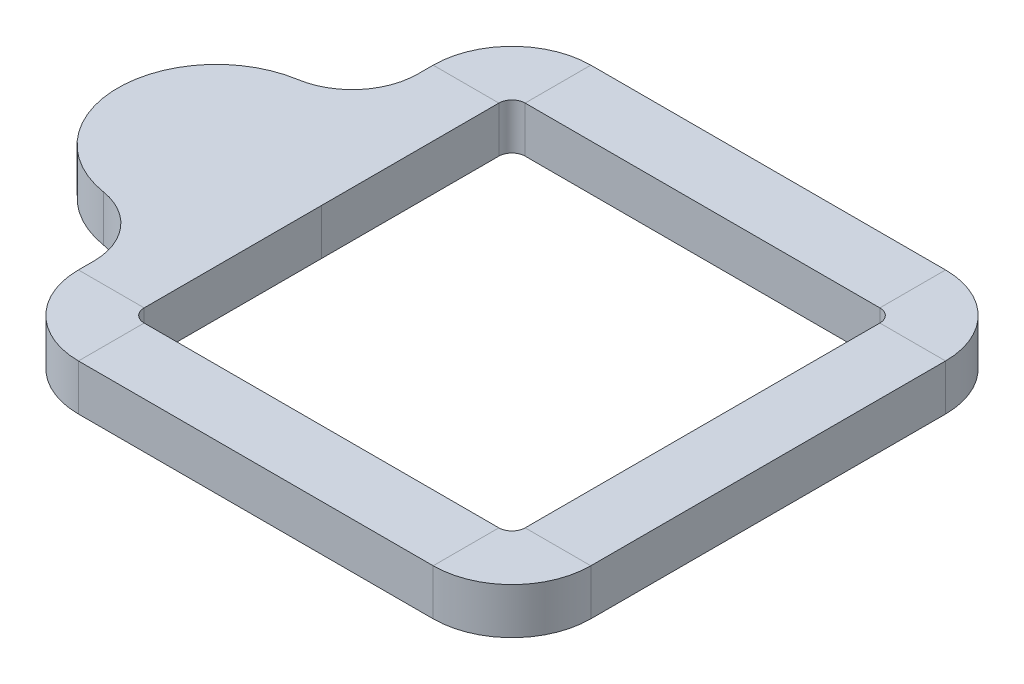
ISO-10303-21;
HEADER;
FILE_DESCRIPTION(('STEP AP214'),'2;1');
FILE_NAME('part.step','',(''),(''),'','','');
FILE_SCHEMA(('AUTOMOTIVE_DESIGN { 1 0 10303 214 1 1 1 1 }'));
ENDSEC;
DATA;
#1=APPLICATION_CONTEXT('core data for automotive mechanical design processes');
#2=APPLICATION_PROTOCOL_DEFINITION('international standard','automotive_design',2000,#1);
#3=PRODUCT_CONTEXT('',#1,'mechanical');
#4=PRODUCT('Part','Part','',(#3));
#5=PRODUCT_RELATED_PRODUCT_CATEGORY('part','',(#4));
#6=PRODUCT_DEFINITION_FORMATION('','',#4);
#7=PRODUCT_DEFINITION_CONTEXT('part definition',#1,'design');
#8=PRODUCT_DEFINITION('design','',#6,#7);
#9=PRODUCT_DEFINITION_SHAPE('','',#8);
#10=(LENGTH_UNIT() NAMED_UNIT(*) SI_UNIT(.MILLI.,.METRE.));
#11=(NAMED_UNIT(*) PLANE_ANGLE_UNIT() SI_UNIT($,.RADIAN.));
#12=(NAMED_UNIT(*) SI_UNIT($,.STERADIAN.) SOLID_ANGLE_UNIT());
#13=UNCERTAINTY_MEASURE_WITH_UNIT(LENGTH_MEASURE(1.E-05),#10,'distance_accuracy_value','');
#14=(GEOMETRIC_REPRESENTATION_CONTEXT(3) GLOBAL_UNCERTAINTY_ASSIGNED_CONTEXT((#13)) GLOBAL_UNIT_ASSIGNED_CONTEXT((#10,
#11,#12)) REPRESENTATION_CONTEXT('',''));
#15=CARTESIAN_POINT('',(0.,0.,0.));
#16=DIRECTION('',(0.,0.,1.));
#17=DIRECTION('',(1.,0.,0.));
#18=AXIS2_PLACEMENT_3D('',#15,#16,#17);
#19=CARTESIAN_POINT('',(-30.9265651872034,9.75,11.6730499600373));
#20=DIRECTION('',(1.,0.,0.));
#21=DIRECTION('',(0.,0.,-1.));
#22=AXIS2_PLACEMENT_3D('',#19,#20,#21);
#23=PLANE('',#22);
#24=DIRECTION('',(0.,-1.,0.));
#25=VECTOR('',#24,1.);
#26=CARTESIAN_POINT('',(-30.9265651872034,9.75,11.6730499600373));
#27=LINE('',#26,#25);
#28=CARTESIAN_POINT('',(-30.9265651872034,9.75,11.6730499600373));
#29=VERTEX_POINT('',#28);
#30=CARTESIAN_POINT('',(-30.9265651872034,6.25,11.6730499600373));
#31=VERTEX_POINT('',#30);
#32=EDGE_CURVE('E430',#29,#31,#27,.T.);
#33=ORIENTED_EDGE('',*,*,#32,.T.);
#34=DIRECTION('',(0.,0.,-1.));
#35=VECTOR('',#34,1.);
#36=CARTESIAN_POINT('',(-30.9265651872034,6.25,11.6730499600373));
#37=LINE('',#36,#35);
#38=CARTESIAN_POINT('',(-30.9265651872034,6.25,-1.82695003996267));
#39=VERTEX_POINT('',#38);
#40=EDGE_CURVE('E452',#31,#39,#37,.T.);
#41=ORIENTED_EDGE('',*,*,#40,.T.);
#42=CARTESIAN_POINT('',(-30.9265651872034,9.75,-1.82695003996267));
#43=DIRECTION('',(0.,-1.,0.));
#44=VECTOR('',#43,1.);
#45=LINE('',#42,#44);
#46=CARTESIAN_POINT('',(-30.9265651872034,9.75,-1.82695003996266));
#47=VERTEX_POINT('',#46);
#48=EDGE_CURVE('E189',#47,#39,#45,.T.);
#49=ORIENTED_EDGE('',*,*,#48,.F.);
#50=DIRECTION('',(0.,0.,-1.));
#51=VECTOR('',#50,1.);
#52=CARTESIAN_POINT('',(-30.9265651872034,9.75,11.6730499600373));
#53=LINE('',#52,#51);
#54=EDGE_CURVE('E230',#29,#47,#53,.T.);
#55=ORIENTED_EDGE('',*,*,#54,.F.);
#56=EDGE_LOOP('',(#33,#41,#49,#55));
#57=FACE_BOUND('',#56,.T.);
#58=ADVANCED_FACE('F34',(#57),#23,.T.);
#59=CARTESIAN_POINT('',(-35.9265651872034,9.75,11.6730499600374));
#60=DIRECTION('',(-1.,0.,0.));
#61=DIRECTION('',(0.,0.,1.));
#62=AXIS2_PLACEMENT_3D('',#59,#60,#61);
#63=PLANE('',#62);
#64=DIRECTION('',(0.,0.,-1.));
#65=VECTOR('',#64,1.);
#66=CARTESIAN_POINT('',(-35.9265651872034,9.75,11.6730499600374));
#67=LINE('',#66,#65);
#68=CARTESIAN_POINT('',(-35.9265651872034,9.75,11.6730499600374));
#69=VERTEX_POINT('',#68);
#70=CARTESIAN_POINT('',(-35.9265651872034,9.75,10.5120126392904));
#71=VERTEX_POINT('',#70);
#72=EDGE_CURVE('E445',#69,#71,#67,.T.);
#73=ORIENTED_EDGE('',*,*,#72,.T.);
#74=DIRECTION('',(0.,-1.,0.));
#75=VECTOR('',#74,1.);
#76=CARTESIAN_POINT('',(-35.9265651872034,6.25,10.5120126392904));
#77=LINE('',#76,#75);
#78=CARTESIAN_POINT('',(-35.9265651872034,6.25,10.5120126392904));
#79=VERTEX_POINT('',#78);
#80=EDGE_CURVE('E55',#71,#79,#77,.T.);
#81=ORIENTED_EDGE('',*,*,#80,.T.);
#82=DIRECTION('',(0.,0.,-1.));
#83=VECTOR('',#82,1.);
#84=CARTESIAN_POINT('',(-35.9265651872034,6.25,11.6730499600374));
#85=LINE('',#84,#83);
#86=CARTESIAN_POINT('',(-35.9265651872034,6.25,11.6730499600374));
#87=VERTEX_POINT('',#86);
#88=EDGE_CURVE('E447',#87,#79,#85,.T.);
#89=ORIENTED_EDGE('',*,*,#88,.F.);
#90=DIRECTION('',(0.,1.,0.));
#91=VECTOR('',#90,1.);
#92=CARTESIAN_POINT('',(-35.9265651872034,9.75,11.6730499600374));
#93=LINE('',#92,#91);
#94=EDGE_CURVE('E424',#87,#69,#93,.T.);
#95=ORIENTED_EDGE('',*,*,#94,.T.);
#96=EDGE_LOOP('',(#73,#81,#89,#95));
#97=FACE_BOUND('',#96,.T.);
#98=ADVANCED_FACE('F471',(#97),#63,.T.);
#99=CARTESIAN_POINT('',(-29.9265651872034,6.25,11.6730499600373));
#100=DIRECTION('',(0.,-1.,0.));
#101=DIRECTION('',(0.,0.,-1.));
#102=AXIS2_PLACEMENT_3D('',#99,#100,#101);
#103=CYLINDRICAL_SURFACE('',#102,0.999999999999985);
#104=DIRECTION('',(0.,-1.,0.));
#105=VECTOR('',#104,1.);
#106=CARTESIAN_POINT('',(-29.9265651872034,9.75,12.6730499600373));
#107=LINE('',#106,#105);
#108=CARTESIAN_POINT('',(-29.9265651872034,9.75,12.6730499600373));
#109=VERTEX_POINT('',#108);
#110=CARTESIAN_POINT('',(-29.9265651872034,6.25,12.6730499600373));
#111=VERTEX_POINT('',#110);
#112=EDGE_CURVE('E406',#109,#111,#107,.T.);
#113=ORIENTED_EDGE('',*,*,#112,.T.);
#114=CARTESIAN_POINT('',(-29.9265651872034,6.25,11.6730499600373));
#115=DIRECTION('',(0.,-1.,0.));
#116=DIRECTION('',(0.,0.,-1.));
#117=AXIS2_PLACEMENT_3D('',#114,#115,#116);
#118=CIRCLE('',#117,0.999999999999985);
#119=EDGE_CURVE('E439',#111,#31,#118,.T.);
#120=ORIENTED_EDGE('',*,*,#119,.T.);
#121=ORIENTED_EDGE('',*,*,#32,.F.);
#122=CARTESIAN_POINT('',(-29.9265651872034,9.75,11.6730499600373));
#123=DIRECTION('',(0.,-1.,0.));
#124=DIRECTION('',(0.,0.,-1.));
#125=AXIS2_PLACEMENT_3D('',#122,#123,#124);
#126=CIRCLE('',#125,0.999999999999985);
#127=EDGE_CURVE('E442',#109,#29,#126,.T.);
#128=ORIENTED_EDGE('',*,*,#127,.F.);
#129=EDGE_LOOP('',(#113,#120,#121,#128));
#130=FACE_BOUND('',#129,.T.);
#131=ADVANCED_FACE('F715',(#130),#103,.F.);
#132=CARTESIAN_POINT('',(-29.9265651872034,6.25,12.6730499600373));
#133=DIRECTION('',(0.,-1.,0.));
#134=DIRECTION('',(0.,0.,-1.));
#135=AXIS2_PLACEMENT_3D('',#132,#133,#134);
#136=PLANE('',#135);
#137=DIRECTION('',(0.,0.,1.));
#138=VECTOR('',#137,1.);
#139=CARTESIAN_POINT('',(-29.9265651872034,6.25,12.6730499600373));
#140=LINE('',#139,#138);
#141=CARTESIAN_POINT('',(-29.9265651872034,6.25,17.6730499600373));
#142=VERTEX_POINT('',#141);
#143=EDGE_CURVE('E403',#111,#142,#140,.T.);
#144=ORIENTED_EDGE('',*,*,#143,.T.);
#145=CARTESIAN_POINT('',(-29.9265651872034,6.25,11.6730499600373));
#146=DIRECTION('',(0.,-1.,0.));
#147=DIRECTION('',(0.,0.,-1.));
#148=AXIS2_PLACEMENT_3D('',#145,#146,#147);
#149=CIRCLE('',#148,5.99999999999998);
#150=EDGE_CURVE('E436',#142,#87,#149,.T.);
#151=ORIENTED_EDGE('',*,*,#150,.T.);
#152=DIRECTION('',(-1.,0.,0.));
#153=VECTOR('',#152,1.);
#154=CARTESIAN_POINT('',(-30.9265651872034,6.25,11.6730499600373));
#155=LINE('',#154,#153);
#156=EDGE_CURVE('E427',#31,#87,#155,.T.);
#157=ORIENTED_EDGE('',*,*,#156,.F.);
#158=ORIENTED_EDGE('',*,*,#119,.F.);
#159=EDGE_LOOP('',(#144,#151,#157,#158));
#160=FACE_BOUND('',#159,.T.);
#161=ADVANCED_FACE('F707',(#160),#136,.T.);
#162=CARTESIAN_POINT('',(-29.9265651872034,6.25,11.6730499600373));
#163=DIRECTION('',(0.,-1.,0.));
#164=DIRECTION('',(0.,0.,-1.));
#165=AXIS2_PLACEMENT_3D('',#162,#163,#164);
#166=CYLINDRICAL_SURFACE('',#165,5.99999999999998);
#167=DIRECTION('',(0.,1.,0.));
#168=VECTOR('',#167,1.);
#169=CARTESIAN_POINT('',(-29.9265651872034,9.75,17.6730499600373));
#170=LINE('',#169,#168);
#171=CARTESIAN_POINT('',(-29.9265651872034,9.75,17.6730499600373));
#172=VERTEX_POINT('',#171);
#173=EDGE_CURVE('E400',#142,#172,#170,.T.);
#174=ORIENTED_EDGE('',*,*,#173,.T.);
#175=CARTESIAN_POINT('',(-29.9265651872034,9.75,11.6730499600373));
#176=DIRECTION('',(0.,-1.,0.));
#177=DIRECTION('',(0.,0.,-1.));
#178=AXIS2_PLACEMENT_3D('',#175,#176,#177);
#179=CIRCLE('',#178,5.99999999999998);
#180=EDGE_CURVE('E433',#172,#69,#179,.T.);
#181=ORIENTED_EDGE('',*,*,#180,.T.);
#182=ORIENTED_EDGE('',*,*,#94,.F.);
#183=ORIENTED_EDGE('',*,*,#150,.F.);
#184=EDGE_LOOP('',(#174,#181,#182,#183));
#185=FACE_BOUND('',#184,.T.);
#186=ADVANCED_FACE('F699',(#185),#166,.T.);
#187=CARTESIAN_POINT('',(-29.9265651872034,9.75,12.6730499600373));
#188=DIRECTION('',(0.,1.,0.));
#189=DIRECTION('',(0.,0.,1.));
#190=AXIS2_PLACEMENT_3D('',#187,#188,#189);
#191=PLANE('',#190);
#192=DIRECTION('',(0.,0.,-1.));
#193=VECTOR('',#192,1.);
#194=CARTESIAN_POINT('',(-29.9265651872034,9.75,12.6730499600373));
#195=LINE('',#194,#193);
#196=EDGE_CURVE('E397',#172,#109,#195,.T.);
#197=ORIENTED_EDGE('',*,*,#196,.T.);
#198=ORIENTED_EDGE('',*,*,#127,.T.);
#199=DIRECTION('',(1.,0.,0.));
#200=VECTOR('',#199,1.);
#201=CARTESIAN_POINT('',(-30.9265651872034,9.75,11.6730499600373));
#202=LINE('',#201,#200);
#203=EDGE_CURVE('E421',#69,#29,#202,.T.);
#204=ORIENTED_EDGE('',*,*,#203,.F.);
#205=ORIENTED_EDGE('',*,*,#180,.F.);
#206=EDGE_LOOP('',(#197,#198,#204,#205));
#207=FACE_BOUND('',#206,.T.);
#208=ADVANCED_FACE('F691',(#207),#191,.T.);
#209=CARTESIAN_POINT('',(-2.92656518720342,9.75,12.6730499600373));
#210=DIRECTION('',(0.,0.,-1.));
#211=DIRECTION('',(-1.,0.,0.));
#212=AXIS2_PLACEMENT_3D('',#209,#210,#211);
#213=PLANE('',#212);
#214=DIRECTION('',(0.,-1.,0.));
#215=VECTOR('',#214,1.);
#216=CARTESIAN_POINT('',(-2.92656518720342,9.75,12.6730499600373));
#217=LINE('',#216,#215);
#218=CARTESIAN_POINT('',(-2.92656518720342,9.75,12.6730499600373));
#219=VERTEX_POINT('',#218);
#220=CARTESIAN_POINT('',(-2.92656518720342,6.25,12.6730499600373));
#221=VERTEX_POINT('',#220);
#222=EDGE_CURVE('E382',#219,#221,#217,.T.);
#223=ORIENTED_EDGE('',*,*,#222,.T.);
#224=DIRECTION('',(-1.,0.,0.));
#225=VECTOR('',#224,1.);
#226=CARTESIAN_POINT('',(-2.92656518720342,6.25,12.6730499600373));
#227=LINE('',#226,#225);
#228=EDGE_CURVE('E415',#221,#111,#227,.T.);
#229=ORIENTED_EDGE('',*,*,#228,.T.);
#230=ORIENTED_EDGE('',*,*,#112,.F.);
#231=DIRECTION('',(-1.,0.,0.));
#232=VECTOR('',#231,1.);
#233=CARTESIAN_POINT('',(-2.92656518720342,9.75,12.6730499600373));
#234=LINE('',#233,#232);
#235=EDGE_CURVE('E418',#219,#109,#234,.T.);
#236=ORIENTED_EDGE('',*,*,#235,.F.);
#237=EDGE_LOOP('',(#223,#229,#230,#236));
#238=FACE_BOUND('',#237,.T.);
#239=ADVANCED_FACE('F683',(#238),#213,.T.);
#240=CARTESIAN_POINT('',(-2.92656518720342,6.25,12.6730499600373));
#241=DIRECTION('',(0.,-1.,0.));
#242=DIRECTION('',(0.,0.,-1.));
#243=AXIS2_PLACEMENT_3D('',#240,#241,#242);
#244=PLANE('',#243);
#245=DIRECTION('',(0.,0.,1.));
#246=VECTOR('',#245,1.);
#247=CARTESIAN_POINT('',(-2.92656518720342,6.25,12.6730499600373));
#248=LINE('',#247,#246);
#249=CARTESIAN_POINT('',(-2.92656518720339,6.25,17.6730499600373));
#250=VERTEX_POINT('',#249);
#251=EDGE_CURVE('E379',#221,#250,#248,.T.);
#252=ORIENTED_EDGE('',*,*,#251,.T.);
#253=DIRECTION('',(-1.,0.,0.));
#254=VECTOR('',#253,1.);
#255=CARTESIAN_POINT('',(-2.92656518720339,6.25,17.6730499600373));
#256=LINE('',#255,#254);
#257=EDGE_CURVE('E412',#250,#142,#256,.T.);
#258=ORIENTED_EDGE('',*,*,#257,.T.);
#259=ORIENTED_EDGE('',*,*,#143,.F.);
#260=ORIENTED_EDGE('',*,*,#228,.F.);
#261=EDGE_LOOP('',(#252,#258,#259,#260));
#262=FACE_BOUND('',#261,.T.);
#263=ADVANCED_FACE('F675',(#262),#244,.T.);
#264=CARTESIAN_POINT('',(-2.92656518720339,9.75,17.6730499600373));
#265=DIRECTION('',(0.,0.,1.));
#266=DIRECTION('',(1.,0.,0.));
#267=AXIS2_PLACEMENT_3D('',#264,#265,#266);
#268=PLANE('',#267);
#269=DIRECTION('',(0.,1.,0.));
#270=VECTOR('',#269,1.);
#271=CARTESIAN_POINT('',(-2.92656518720339,9.75,17.6730499600373));
#272=LINE('',#271,#270);
#273=CARTESIAN_POINT('',(-2.92656518720339,9.75,17.6730499600373));
#274=VERTEX_POINT('',#273);
#275=EDGE_CURVE('E376',#250,#274,#272,.T.);
#276=ORIENTED_EDGE('',*,*,#275,.T.);
#277=DIRECTION('',(-1.,0.,0.));
#278=VECTOR('',#277,1.);
#279=CARTESIAN_POINT('',(-2.92656518720339,9.75,17.6730499600373));
#280=LINE('',#279,#278);
#281=EDGE_CURVE('E409',#274,#172,#280,.T.);
#282=ORIENTED_EDGE('',*,*,#281,.T.);
#283=ORIENTED_EDGE('',*,*,#173,.F.);
#284=ORIENTED_EDGE('',*,*,#257,.F.);
#285=EDGE_LOOP('',(#276,#282,#283,#284));
#286=FACE_BOUND('',#285,.T.);
#287=ADVANCED_FACE('F667',(#286),#268,.T.);
#288=CARTESIAN_POINT('',(-2.92656518720342,9.75,12.6730499600373));
#289=DIRECTION('',(0.,1.,0.));
#290=DIRECTION('',(0.,0.,1.));
#291=AXIS2_PLACEMENT_3D('',#288,#289,#290);
#292=PLANE('',#291);
#293=DIRECTION('',(0.,0.,-1.));
#294=VECTOR('',#293,1.);
#295=CARTESIAN_POINT('',(-2.92656518720342,9.75,12.6730499600373));
#296=LINE('',#295,#294);
#297=EDGE_CURVE('E373',#274,#219,#296,.T.);
#298=ORIENTED_EDGE('',*,*,#297,.T.);
#299=ORIENTED_EDGE('',*,*,#235,.T.);
#300=ORIENTED_EDGE('',*,*,#196,.F.);
#301=ORIENTED_EDGE('',*,*,#281,.F.);
#302=EDGE_LOOP('',(#298,#299,#300,#301));
#303=FACE_BOUND('',#302,.T.);
#304=ADVANCED_FACE('F659',(#303),#292,.T.);
#305=CARTESIAN_POINT('',(-2.92656518720344,6.25,11.6730499600373));
#306=DIRECTION('',(0.,-1.,0.));
#307=DIRECTION('',(0.,0.,-1.));
#308=AXIS2_PLACEMENT_3D('',#305,#306,#307);
#309=CYLINDRICAL_SURFACE('',#308,0.999999999999987);
#310=DIRECTION('',(0.,-1.,0.));
#311=VECTOR('',#310,1.);
#312=CARTESIAN_POINT('',(-1.92656518720345,9.75,11.6730499600373));
#313=LINE('',#312,#311);
#314=CARTESIAN_POINT('',(-1.92656518720345,9.75,11.6730499600373));
#315=VERTEX_POINT('',#314);
#316=CARTESIAN_POINT('',(-1.92656518720345,6.25,11.6730499600373));
#317=VERTEX_POINT('',#316);
#318=EDGE_CURVE('E358',#315,#317,#313,.T.);
#319=ORIENTED_EDGE('',*,*,#318,.T.);
#320=CARTESIAN_POINT('',(-2.92656518720344,6.25,11.6730499600373));
#321=DIRECTION('',(0.,-1.,0.));
#322=DIRECTION('',(0.,0.,-1.));
#323=AXIS2_PLACEMENT_3D('',#320,#321,#322);
#324=CIRCLE('',#323,0.999999999999987);
#325=EDGE_CURVE('E391',#317,#221,#324,.T.);
#326=ORIENTED_EDGE('',*,*,#325,.T.);
#327=ORIENTED_EDGE('',*,*,#222,.F.);
#328=CARTESIAN_POINT('',(-2.92656518720344,9.75,11.6730499600373));
#329=DIRECTION('',(0.,-1.,0.));
#330=DIRECTION('',(0.,0.,-1.));
#331=AXIS2_PLACEMENT_3D('',#328,#329,#330);
#332=CIRCLE('',#331,0.999999999999987);
#333=EDGE_CURVE('E394',#315,#219,#332,.T.);
#334=ORIENTED_EDGE('',*,*,#333,.F.);
#335=EDGE_LOOP('',(#319,#326,#327,#334));
#336=FACE_BOUND('',#335,.T.);
#337=ADVANCED_FACE('F651',(#336),#309,.F.);
#338=CARTESIAN_POINT('',(-1.92656518720345,6.25,11.6730499600373));
#339=DIRECTION('',(0.,-1.,0.));
#340=DIRECTION('',(0.,0.,-1.));
#341=AXIS2_PLACEMENT_3D('',#338,#339,#340);
#342=PLANE('',#341);
#343=DIRECTION('',(1.,0.,0.));
#344=VECTOR('',#343,1.);
#345=CARTESIAN_POINT('',(-1.92656518720345,6.25,11.6730499600373));
#346=LINE('',#345,#344);
#347=CARTESIAN_POINT('',(3.07343481279655,6.25,11.6730499600374));
#348=VERTEX_POINT('',#347);
#349=EDGE_CURVE('E355',#317,#348,#346,.T.);
#350=ORIENTED_EDGE('',*,*,#349,.T.);
#351=CARTESIAN_POINT('',(-2.92656518720344,6.25,11.6730499600373));
#352=DIRECTION('',(0.,-1.,0.));
#353=DIRECTION('',(0.,0.,-1.));
#354=AXIS2_PLACEMENT_3D('',#351,#352,#353);
#355=CIRCLE('',#354,5.99999999999998);
#356=EDGE_CURVE('E388',#348,#250,#355,.T.);
#357=ORIENTED_EDGE('',*,*,#356,.T.);
#358=ORIENTED_EDGE('',*,*,#251,.F.);
#359=ORIENTED_EDGE('',*,*,#325,.F.);
#360=EDGE_LOOP('',(#350,#357,#358,#359));
#361=FACE_BOUND('',#360,.T.);
#362=ADVANCED_FACE('F643',(#361),#342,.T.);
#363=CARTESIAN_POINT('',(-2.92656518720344,6.25,11.6730499600373));
#364=DIRECTION('',(0.,-1.,0.));
#365=DIRECTION('',(0.,0.,-1.));
#366=AXIS2_PLACEMENT_3D('',#363,#364,#365);
#367=CYLINDRICAL_SURFACE('',#366,5.99999999999998);
#368=DIRECTION('',(0.,1.,0.));
#369=VECTOR('',#368,1.);
#370=CARTESIAN_POINT('',(3.07343481279655,9.75,11.6730499600374));
#371=LINE('',#370,#369);
#372=CARTESIAN_POINT('',(3.07343481279655,9.75,11.6730499600374));
#373=VERTEX_POINT('',#372);
#374=EDGE_CURVE('E352',#348,#373,#371,.T.);
#375=ORIENTED_EDGE('',*,*,#374,.T.);
#376=CARTESIAN_POINT('',(-2.92656518720344,9.75,11.6730499600373));
#377=DIRECTION('',(0.,-1.,0.));
#378=DIRECTION('',(0.,0.,-1.));
#379=AXIS2_PLACEMENT_3D('',#376,#377,#378);
#380=CIRCLE('',#379,5.99999999999998);
#381=EDGE_CURVE('E385',#373,#274,#380,.T.);
#382=ORIENTED_EDGE('',*,*,#381,.T.);
#383=ORIENTED_EDGE('',*,*,#275,.F.);
#384=ORIENTED_EDGE('',*,*,#356,.F.);
#385=EDGE_LOOP('',(#375,#382,#383,#384));
#386=FACE_BOUND('',#385,.T.);
#387=ADVANCED_FACE('F635',(#386),#367,.T.);
#388=CARTESIAN_POINT('',(-1.92656518720345,9.75,11.6730499600373));
#389=DIRECTION('',(0.,1.,0.));
#390=DIRECTION('',(0.,0.,1.));
#391=AXIS2_PLACEMENT_3D('',#388,#389,#390);
#392=PLANE('',#391);
#393=DIRECTION('',(-1.,0.,0.));
#394=VECTOR('',#393,1.);
#395=CARTESIAN_POINT('',(-1.92656518720345,9.75,11.6730499600373));
#396=LINE('',#395,#394);
#397=EDGE_CURVE('E349',#373,#315,#396,.T.);
#398=ORIENTED_EDGE('',*,*,#397,.T.);
#399=ORIENTED_EDGE('',*,*,#333,.T.);
#400=ORIENTED_EDGE('',*,*,#297,.F.);
#401=ORIENTED_EDGE('',*,*,#381,.F.);
#402=EDGE_LOOP('',(#398,#399,#400,#401));
#403=FACE_BOUND('',#402,.T.);
#404=ADVANCED_FACE('F627',(#403),#392,.T.);
#405=CARTESIAN_POINT('',(-1.92656518720345,9.75,-15.3269500399627));
#406=DIRECTION('',(-1.,0.,0.));
#407=DIRECTION('',(0.,0.,1.));
#408=AXIS2_PLACEMENT_3D('',#405,#406,#407);
#409=PLANE('',#408);
#410=DIRECTION('',(0.,-1.,0.));
#411=VECTOR('',#410,1.);
#412=CARTESIAN_POINT('',(-1.92656518720345,9.75,-15.3269500399627));
#413=LINE('',#412,#411);
#414=CARTESIAN_POINT('',(-1.92656518720345,9.75,-15.3269500399627));
#415=VERTEX_POINT('',#414);
#416=CARTESIAN_POINT('',(-1.92656518720345,6.25,-15.3269500399627));
#417=VERTEX_POINT('',#416);
#418=EDGE_CURVE('E334',#415,#417,#413,.T.);
#419=ORIENTED_EDGE('',*,*,#418,.T.);
#420=DIRECTION('',(0.,0.,1.));
#421=VECTOR('',#420,1.);
#422=CARTESIAN_POINT('',(-1.92656518720345,6.25,-15.3269500399627));
#423=LINE('',#422,#421);
#424=EDGE_CURVE('E367',#417,#317,#423,.T.);
#425=ORIENTED_EDGE('',*,*,#424,.T.);
#426=ORIENTED_EDGE('',*,*,#318,.F.);
#427=DIRECTION('',(0.,0.,1.));
#428=VECTOR('',#427,1.);
#429=CARTESIAN_POINT('',(-1.92656518720345,9.75,-15.3269500399627));
#430=LINE('',#429,#428);
#431=EDGE_CURVE('E370',#415,#315,#430,.T.);
#432=ORIENTED_EDGE('',*,*,#431,.F.);
#433=EDGE_LOOP('',(#419,#425,#426,#432));
#434=FACE_BOUND('',#433,.T.);
#435=ADVANCED_FACE('F619',(#434),#409,.T.);
#436=CARTESIAN_POINT('',(-1.92656518720345,6.25,-15.3269500399627));
#437=DIRECTION('',(0.,-1.,0.));
#438=DIRECTION('',(1.,0.,0.));
#439=AXIS2_PLACEMENT_3D('',#436,#437,#438);
#440=PLANE('',#439);
#441=DIRECTION('',(1.,0.,0.));
#442=VECTOR('',#441,1.);
#443=CARTESIAN_POINT('',(-1.92656518720345,6.25,-15.3269500399627));
#444=LINE('',#443,#442);
#445=CARTESIAN_POINT('',(3.07343481279655,6.25,-15.3269500399627));
#446=VERTEX_POINT('',#445);
#447=EDGE_CURVE('E331',#417,#446,#444,.T.);
#448=ORIENTED_EDGE('',*,*,#447,.T.);
#449=DIRECTION('',(0.,0.,1.));
#450=VECTOR('',#449,1.);
#451=CARTESIAN_POINT('',(3.07343481279655,6.25,-15.3269500399627));
#452=LINE('',#451,#450);
#453=EDGE_CURVE('E364',#446,#348,#452,.T.);
#454=ORIENTED_EDGE('',*,*,#453,.T.);
#455=ORIENTED_EDGE('',*,*,#349,.F.);
#456=ORIENTED_EDGE('',*,*,#424,.F.);
#457=EDGE_LOOP('',(#448,#454,#455,#456));
#458=FACE_BOUND('',#457,.T.);
#459=ADVANCED_FACE('F611',(#458),#440,.T.);
#460=CARTESIAN_POINT('',(3.07343481279655,9.75,-15.3269500399627));
#461=DIRECTION('',(1.,0.,0.));
#462=DIRECTION('',(0.,0.,-1.));
#463=AXIS2_PLACEMENT_3D('',#460,#461,#462);
#464=PLANE('',#463);
#465=DIRECTION('',(0.,1.,0.));
#466=VECTOR('',#465,1.);
#467=CARTESIAN_POINT('',(3.07343481279655,9.75,-15.3269500399627));
#468=LINE('',#467,#466);
#469=CARTESIAN_POINT('',(3.07343481279655,9.75,-15.3269500399627));
#470=VERTEX_POINT('',#469);
#471=EDGE_CURVE('E328',#446,#470,#468,.T.);
#472=ORIENTED_EDGE('',*,*,#471,.T.);
#473=DIRECTION('',(0.,0.,1.));
#474=VECTOR('',#473,1.);
#475=CARTESIAN_POINT('',(3.07343481279655,9.75,-15.3269500399627));
#476=LINE('',#475,#474);
#477=EDGE_CURVE('E361',#470,#373,#476,.T.);
#478=ORIENTED_EDGE('',*,*,#477,.T.);
#479=ORIENTED_EDGE('',*,*,#374,.F.);
#480=ORIENTED_EDGE('',*,*,#453,.F.);
#481=EDGE_LOOP('',(#472,#478,#479,#480));
#482=FACE_BOUND('',#481,.T.);
#483=ADVANCED_FACE('F603',(#482),#464,.T.);
#484=CARTESIAN_POINT('',(-1.92656518720345,9.75,-15.3269500399627));
#485=DIRECTION('',(0.,1.,0.));
#486=DIRECTION('',(-1.,0.,0.));
#487=AXIS2_PLACEMENT_3D('',#484,#485,#486);
#488=PLANE('',#487);
#489=DIRECTION('',(-1.,0.,0.));
#490=VECTOR('',#489,1.);
#491=CARTESIAN_POINT('',(-1.92656518720345,9.75,-15.3269500399627));
#492=LINE('',#491,#490);
#493=EDGE_CURVE('E325',#470,#415,#492,.T.);
#494=ORIENTED_EDGE('',*,*,#493,.T.);
#495=ORIENTED_EDGE('',*,*,#431,.T.);
#496=ORIENTED_EDGE('',*,*,#397,.F.);
#497=ORIENTED_EDGE('',*,*,#477,.F.);
#498=EDGE_LOOP('',(#494,#495,#496,#497));
#499=FACE_BOUND('',#498,.T.);
#500=ADVANCED_FACE('F595',(#499),#488,.T.);
#501=CARTESIAN_POINT('',(-2.92656518720344,6.25,-15.3269500399627));
#502=DIRECTION('',(0.,-1.,0.));
#503=DIRECTION('',(0.,0.,-1.));
#504=AXIS2_PLACEMENT_3D('',#501,#502,#503);
#505=CYLINDRICAL_SURFACE('',#504,0.99999999999999);
#506=DIRECTION('',(0.,-1.,0.));
#507=VECTOR('',#506,1.);
#508=CARTESIAN_POINT('',(-2.92656518720345,9.75,-16.3269500399627));
#509=LINE('',#508,#507);
#510=CARTESIAN_POINT('',(-2.92656518720345,9.75,-16.3269500399627));
#511=VERTEX_POINT('',#510);
#512=CARTESIAN_POINT('',(-2.92656518720345,6.25,-16.3269500399627));
#513=VERTEX_POINT('',#512);
#514=EDGE_CURVE('E310',#511,#513,#509,.T.);
#515=ORIENTED_EDGE('',*,*,#514,.T.);
#516=CARTESIAN_POINT('',(-2.92656518720344,6.25,-15.3269500399627));
#517=DIRECTION('',(0.,-1.,0.));
#518=DIRECTION('',(0.,0.,-1.));
#519=AXIS2_PLACEMENT_3D('',#516,#517,#518);
#520=CIRCLE('',#519,0.99999999999999);
#521=EDGE_CURVE('E343',#513,#417,#520,.T.);
#522=ORIENTED_EDGE('',*,*,#521,.T.);
#523=ORIENTED_EDGE('',*,*,#418,.F.);
#524=CARTESIAN_POINT('',(-2.92656518720344,9.75,-15.3269500399627));
#525=DIRECTION('',(0.,-1.,0.));
#526=DIRECTION('',(0.,0.,-1.));
#527=AXIS2_PLACEMENT_3D('',#524,#525,#526);
#528=CIRCLE('',#527,0.99999999999999);
#529=EDGE_CURVE('E346',#511,#415,#528,.T.);
#530=ORIENTED_EDGE('',*,*,#529,.F.);
#531=EDGE_LOOP('',(#515,#522,#523,#530));
#532=FACE_BOUND('',#531,.T.);
#533=ADVANCED_FACE('F587',(#532),#505,.F.);
#534=CARTESIAN_POINT('',(-2.92656518720345,6.25,-16.3269500399627));
#535=DIRECTION('',(0.,-1.,0.));
#536=DIRECTION('',(0.,0.,-1.));
#537=AXIS2_PLACEMENT_3D('',#534,#535,#536);
#538=PLANE('',#537);
#539=DIRECTION('',(0.,0.,-1.));
#540=VECTOR('',#539,1.);
#541=CARTESIAN_POINT('',(-2.92656518720345,6.25,-16.3269500399627));
#542=LINE('',#541,#540);
#543=CARTESIAN_POINT('',(-2.92656518720343,6.25,-21.3269500399627));
#544=VERTEX_POINT('',#543);
#545=EDGE_CURVE('E307',#513,#544,#542,.T.);
#546=ORIENTED_EDGE('',*,*,#545,.T.);
#547=CARTESIAN_POINT('',(-2.92656518720344,6.25,-15.3269500399627));
#548=DIRECTION('',(0.,-1.,0.));
#549=DIRECTION('',(0.,0.,-1.));
#550=AXIS2_PLACEMENT_3D('',#547,#548,#549);
#551=CIRCLE('',#550,5.99999999999999);
#552=EDGE_CURVE('E340',#544,#446,#551,.T.);
#553=ORIENTED_EDGE('',*,*,#552,.T.);
#554=ORIENTED_EDGE('',*,*,#447,.F.);
#555=ORIENTED_EDGE('',*,*,#521,.F.);
#556=EDGE_LOOP('',(#546,#553,#554,#555));
#557=FACE_BOUND('',#556,.T.);
#558=ADVANCED_FACE('F579',(#557),#538,.T.);
#559=CARTESIAN_POINT('',(-2.92656518720344,6.25,-15.3269500399627));
#560=DIRECTION('',(0.,-1.,0.));
#561=DIRECTION('',(0.,0.,-1.));
#562=AXIS2_PLACEMENT_3D('',#559,#560,#561);
#563=CYLINDRICAL_SURFACE('',#562,5.99999999999999);
#564=DIRECTION('',(0.,1.,0.));
#565=VECTOR('',#564,1.);
#566=CARTESIAN_POINT('',(-2.92656518720343,9.75,-21.3269500399627));
#567=LINE('',#566,#565);
#568=CARTESIAN_POINT('',(-2.92656518720343,9.75,-21.3269500399627));
#569=VERTEX_POINT('',#568);
#570=EDGE_CURVE('E304',#544,#569,#567,.T.);
#571=ORIENTED_EDGE('',*,*,#570,.T.);
#572=CARTESIAN_POINT('',(-2.92656518720344,9.75,-15.3269500399627));
#573=DIRECTION('',(0.,-1.,0.));
#574=DIRECTION('',(0.,0.,-1.));
#575=AXIS2_PLACEMENT_3D('',#572,#573,#574);
#576=CIRCLE('',#575,5.99999999999999);
#577=EDGE_CURVE('E337',#569,#470,#576,.T.);
#578=ORIENTED_EDGE('',*,*,#577,.T.);
#579=ORIENTED_EDGE('',*,*,#471,.F.);
#580=ORIENTED_EDGE('',*,*,#552,.F.);
#581=EDGE_LOOP('',(#571,#578,#579,#580));
#582=FACE_BOUND('',#581,.T.);
#583=ADVANCED_FACE('F571',(#582),#563,.T.);
#584=CARTESIAN_POINT('',(-2.92656518720345,9.75,-16.3269500399627));
#585=DIRECTION('',(0.,1.,0.));
#586=DIRECTION('',(0.,0.,1.));
#587=AXIS2_PLACEMENT_3D('',#584,#585,#586);
#588=PLANE('',#587);
#589=DIRECTION('',(0.,0.,1.));
#590=VECTOR('',#589,1.);
#591=CARTESIAN_POINT('',(-2.92656518720345,9.75,-16.3269500399627));
#592=LINE('',#591,#590);
#593=EDGE_CURVE('E301',#569,#511,#592,.T.);
#594=ORIENTED_EDGE('',*,*,#593,.T.);
#595=ORIENTED_EDGE('',*,*,#529,.T.);
#596=ORIENTED_EDGE('',*,*,#493,.F.);
#597=ORIENTED_EDGE('',*,*,#577,.F.);
#598=EDGE_LOOP('',(#594,#595,#596,#597));
#599=FACE_BOUND('',#598,.T.);
#600=ADVANCED_FACE('F563',(#599),#588,.T.);
#601=CARTESIAN_POINT('',(-29.9265651872035,9.75,-16.3269500399627));
#602=DIRECTION('',(0.,0.,1.));
#603=DIRECTION('',(1.,0.,0.));
#604=AXIS2_PLACEMENT_3D('',#601,#602,#603);
#605=PLANE('',#604);
#606=DIRECTION('',(0.,-1.,0.));
#607=VECTOR('',#606,1.);
#608=CARTESIAN_POINT('',(-29.9265651872035,9.75,-16.3269500399627));
#609=LINE('',#608,#607);
#610=CARTESIAN_POINT('',(-29.9265651872035,9.75,-16.3269500399627));
#611=VERTEX_POINT('',#610);
#612=CARTESIAN_POINT('',(-29.9265651872035,6.25,-16.3269500399627));
#613=VERTEX_POINT('',#612);
#614=EDGE_CURVE('E286',#611,#613,#609,.T.);
#615=ORIENTED_EDGE('',*,*,#614,.T.);
#616=DIRECTION('',(1.,0.,0.));
#617=VECTOR('',#616,1.);
#618=CARTESIAN_POINT('',(-29.9265651872035,6.25,-16.3269500399627));
#619=LINE('',#618,#617);
#620=EDGE_CURVE('E319',#613,#513,#619,.T.);
#621=ORIENTED_EDGE('',*,*,#620,.T.);
#622=ORIENTED_EDGE('',*,*,#514,.F.);
#623=DIRECTION('',(1.,0.,0.));
#624=VECTOR('',#623,1.);
#625=CARTESIAN_POINT('',(-29.9265651872035,9.75,-16.3269500399627));
#626=LINE('',#625,#624);
#627=EDGE_CURVE('E322',#611,#511,#626,.T.);
#628=ORIENTED_EDGE('',*,*,#627,.F.);
#629=EDGE_LOOP('',(#615,#621,#622,#628));
#630=FACE_BOUND('',#629,.T.);
#631=ADVANCED_FACE('F555',(#630),#605,.T.);
#632=CARTESIAN_POINT('',(-29.9265651872035,6.25,-16.3269500399627));
#633=DIRECTION('',(0.,-1.,0.));
#634=DIRECTION('',(0.,0.,-1.));
#635=AXIS2_PLACEMENT_3D('',#632,#633,#634);
#636=PLANE('',#635);
#637=DIRECTION('',(0.,0.,-1.));
#638=VECTOR('',#637,1.);
#639=CARTESIAN_POINT('',(-29.9265651872035,6.25,-16.3269500399627));
#640=LINE('',#639,#638);
#641=CARTESIAN_POINT('',(-29.9265651872034,6.25,-21.3269500399627));
#642=VERTEX_POINT('',#641);
#643=EDGE_CURVE('E283',#613,#642,#640,.T.);
#644=ORIENTED_EDGE('',*,*,#643,.T.);
#645=DIRECTION('',(1.,0.,0.));
#646=VECTOR('',#645,1.);
#647=CARTESIAN_POINT('',(-29.9265651872034,6.25,-21.3269500399627));
#648=LINE('',#647,#646);
#649=EDGE_CURVE('E316',#642,#544,#648,.T.);
#650=ORIENTED_EDGE('',*,*,#649,.T.);
#651=ORIENTED_EDGE('',*,*,#545,.F.);
#652=ORIENTED_EDGE('',*,*,#620,.F.);
#653=EDGE_LOOP('',(#644,#650,#651,#652));
#654=FACE_BOUND('',#653,.T.);
#655=ADVANCED_FACE('F547',(#654),#636,.T.);
#656=CARTESIAN_POINT('',(-29.9265651872034,9.75,-21.3269500399627));
#657=DIRECTION('',(0.,0.,-1.));
#658=DIRECTION('',(-1.,0.,0.));
#659=AXIS2_PLACEMENT_3D('',#656,#657,#658);
#660=PLANE('',#659);
#661=DIRECTION('',(0.,1.,0.));
#662=VECTOR('',#661,1.);
#663=CARTESIAN_POINT('',(-29.9265651872034,9.75,-21.3269500399627));
#664=LINE('',#663,#662);
#665=CARTESIAN_POINT('',(-29.9265651872034,9.75,-21.3269500399627));
#666=VERTEX_POINT('',#665);
#667=EDGE_CURVE('E279',#642,#666,#664,.T.);
#668=ORIENTED_EDGE('',*,*,#667,.T.);
#669=DIRECTION('',(1.,0.,0.));
#670=VECTOR('',#669,1.);
#671=CARTESIAN_POINT('',(-29.9265651872034,9.75,-21.3269500399627));
#672=LINE('',#671,#670);
#673=EDGE_CURVE('E313',#666,#569,#672,.T.);
#674=ORIENTED_EDGE('',*,*,#673,.T.);
#675=ORIENTED_EDGE('',*,*,#570,.F.);
#676=ORIENTED_EDGE('',*,*,#649,.F.);
#677=EDGE_LOOP('',(#668,#674,#675,#676));
#678=FACE_BOUND('',#677,.T.);
#679=ADVANCED_FACE('F539',(#678),#660,.T.);
#680=CARTESIAN_POINT('',(-29.9265651872035,9.75,-16.3269500399627));
#681=DIRECTION('',(0.,1.,0.));
#682=DIRECTION('',(0.,0.,1.));
#683=AXIS2_PLACEMENT_3D('',#680,#681,#682);
#684=PLANE('',#683);
#685=DIRECTION('',(0.,0.,1.));
#686=VECTOR('',#685,1.);
#687=CARTESIAN_POINT('',(-29.9265651872035,9.75,-16.3269500399627));
#688=LINE('',#687,#686);
#689=EDGE_CURVE('E276',#666,#611,#688,.T.);
#690=ORIENTED_EDGE('',*,*,#689,.T.);
#691=ORIENTED_EDGE('',*,*,#627,.T.);
#692=ORIENTED_EDGE('',*,*,#593,.F.);
#693=ORIENTED_EDGE('',*,*,#673,.F.);
#694=EDGE_LOOP('',(#690,#691,#692,#693));
#695=FACE_BOUND('',#694,.T.);
#696=ADVANCED_FACE('F531',(#695),#684,.T.);
#697=CARTESIAN_POINT('',(-29.9265651872034,6.25,-15.3269500399627));
#698=DIRECTION('',(0.,-1.,0.));
#699=DIRECTION('',(0.,0.,-1.));
#700=AXIS2_PLACEMENT_3D('',#697,#698,#699);
#701=CYLINDRICAL_SURFACE('',#700,0.99999999999999);
#702=DIRECTION('',(0.,-1.,0.));
#703=VECTOR('',#702,1.);
#704=CARTESIAN_POINT('',(-30.9265651872034,9.75,-15.3269500399627));
#705=LINE('',#704,#703);
#706=CARTESIAN_POINT('',(-30.9265651872034,9.75,-15.3269500399627));
#707=VERTEX_POINT('',#706);
#708=CARTESIAN_POINT('',(-30.9265651872034,6.25,-15.3269500399627));
#709=VERTEX_POINT('',#708);
#710=EDGE_CURVE('E269',#707,#709,#705,.T.);
#711=ORIENTED_EDGE('',*,*,#710,.T.);
#712=CARTESIAN_POINT('',(-29.9265651872034,6.25,-15.3269500399627));
#713=DIRECTION('',(0.,-1.,0.));
#714=DIRECTION('',(0.,0.,-1.));
#715=AXIS2_PLACEMENT_3D('',#712,#713,#714);
#716=CIRCLE('',#715,0.99999999999999);
#717=EDGE_CURVE('E295',#709,#613,#716,.T.);
#718=ORIENTED_EDGE('',*,*,#717,.T.);
#719=ORIENTED_EDGE('',*,*,#614,.F.);
#720=CARTESIAN_POINT('',(-29.9265651872034,9.75,-15.3269500399627));
#721=DIRECTION('',(0.,-1.,0.));
#722=DIRECTION('',(0.,0.,-1.));
#723=AXIS2_PLACEMENT_3D('',#720,#721,#722);
#724=CIRCLE('',#723,0.99999999999999);
#725=EDGE_CURVE('E298',#707,#611,#724,.T.);
#726=ORIENTED_EDGE('',*,*,#725,.F.);
#727=EDGE_LOOP('',(#711,#718,#719,#726));
#728=FACE_BOUND('',#727,.T.);
#729=ADVANCED_FACE('F523',(#728),#701,.F.);
#730=CARTESIAN_POINT('',(-30.9265651872034,6.25,-15.3269500399627));
#731=DIRECTION('',(0.,-1.,0.));
#732=DIRECTION('',(0.,0.,-1.));
#733=AXIS2_PLACEMENT_3D('',#730,#731,#732);
#734=PLANE('',#733);
#735=DIRECTION('',(-1.,0.,0.));
#736=VECTOR('',#735,1.);
#737=CARTESIAN_POINT('',(-30.9265651872034,6.25,-15.3269500399627));
#738=LINE('',#737,#736);
#739=CARTESIAN_POINT('',(-35.9265651872034,6.25,-15.3269500399627));
#740=VERTEX_POINT('',#739);
#741=EDGE_CURVE('E272',#709,#740,#738,.T.);
#742=ORIENTED_EDGE('',*,*,#741,.T.);
#743=CARTESIAN_POINT('',(-29.9265651872034,6.25,-15.3269500399627));
#744=DIRECTION('',(0.,-1.,0.));
#745=DIRECTION('',(0.,0.,-1.));
#746=AXIS2_PLACEMENT_3D('',#743,#744,#745);
#747=CIRCLE('',#746,5.99999999999999);
#748=EDGE_CURVE('E292',#740,#642,#747,.T.);
#749=ORIENTED_EDGE('',*,*,#748,.T.);
#750=ORIENTED_EDGE('',*,*,#643,.F.);
#751=ORIENTED_EDGE('',*,*,#717,.F.);
#752=EDGE_LOOP('',(#742,#749,#750,#751));
#753=FACE_BOUND('',#752,.T.);
#754=ADVANCED_FACE('F515',(#753),#734,.T.);
#755=CARTESIAN_POINT('',(-29.9265651872034,6.25,-15.3269500399627));
#756=DIRECTION('',(0.,-1.,0.));
#757=DIRECTION('',(0.,0.,-1.));
#758=AXIS2_PLACEMENT_3D('',#755,#756,#757);
#759=CYLINDRICAL_SURFACE('',#758,5.99999999999999);
#760=DIRECTION('',(0.,1.,0.));
#761=VECTOR('',#760,1.);
#762=CARTESIAN_POINT('',(-35.9265651872034,9.75,-15.3269500399627));
#763=LINE('',#762,#761);
#764=CARTESIAN_POINT('',(-35.9265651872034,9.75,-15.3269500399627));
#765=VERTEX_POINT('',#764);
#766=EDGE_CURVE('E253',#740,#765,#763,.T.);
#767=ORIENTED_EDGE('',*,*,#766,.T.);
#768=CARTESIAN_POINT('',(-29.9265651872034,9.75,-15.3269500399627));
#769=DIRECTION('',(0.,-1.,0.));
#770=DIRECTION('',(0.,0.,-1.));
#771=AXIS2_PLACEMENT_3D('',#768,#769,#770);
#772=CIRCLE('',#771,5.99999999999999);
#773=EDGE_CURVE('E289',#765,#666,#772,.T.);
#774=ORIENTED_EDGE('',*,*,#773,.T.);
#775=ORIENTED_EDGE('',*,*,#667,.F.);
#776=ORIENTED_EDGE('',*,*,#748,.F.);
#777=EDGE_LOOP('',(#767,#774,#775,#776));
#778=FACE_BOUND('',#777,.T.);
#779=ADVANCED_FACE('F507',(#778),#759,.T.);
#780=CARTESIAN_POINT('',(-30.9265651872034,9.75,-15.3269500399627));
#781=DIRECTION('',(0.,1.,0.));
#782=DIRECTION('',(0.,0.,1.));
#783=AXIS2_PLACEMENT_3D('',#780,#781,#782);
#784=PLANE('',#783);
#785=DIRECTION('',(1.,0.,0.));
#786=VECTOR('',#785,1.);
#787=CARTESIAN_POINT('',(-30.9265651872034,9.75,-15.3269500399627));
#788=LINE('',#787,#786);
#789=EDGE_CURVE('E264',#765,#707,#788,.T.);
#790=ORIENTED_EDGE('',*,*,#789,.T.);
#791=ORIENTED_EDGE('',*,*,#725,.T.);
#792=ORIENTED_EDGE('',*,*,#689,.F.);
#793=ORIENTED_EDGE('',*,*,#773,.F.);
#794=EDGE_LOOP('',(#790,#791,#792,#793));
#795=FACE_BOUND('',#794,.T.);
#796=ADVANCED_FACE('F502',(#795),#784,.T.);
#797=CARTESIAN_POINT('',(-30.9265651872034,9.75,-15.3269500399627));
#798=DIRECTION('',(0.,-1.,0.));
#799=DIRECTION('',(1.,0.,0.));
#800=AXIS2_PLACEMENT_3D('',#797,#798,#799);
#801=PLANE('',#800);
#802=DIRECTION('',(0.,0.,1.));
#803=VECTOR('',#802,1.);
#804=CARTESIAN_POINT('',(-30.9265651872034,9.75,-15.3269500399627));
#805=LINE('',#804,#803);
#806=EDGE_CURVE('E280',#707,#47,#805,.T.);
#807=ORIENTED_EDGE('',*,*,#806,.F.);
#808=ORIENTED_EDGE('',*,*,#789,.F.);
#809=DIRECTION('',(0.,0.,1.));
#810=VECTOR('',#809,1.);
#811=CARTESIAN_POINT('',(-35.9265651872034,9.75,-15.3269500399627));
#812=LINE('',#811,#810);
#813=CARTESIAN_POINT('',(-35.9265651872034,9.75,-14.1659127192157));
#814=VERTEX_POINT('',#813);
#815=EDGE_CURVE('E254',#765,#814,#812,.T.);
#816=ORIENTED_EDGE('',*,*,#815,.T.);
#817=CARTESIAN_POINT('',(-40.9265651872034,9.75,-14.1659127192157));
#818=DIRECTION('',(0.,-1.,0.));
#819=DIRECTION('',(1.,0.,0.));
#820=AXIS2_PLACEMENT_3D('',#817,#818,#819);
#821=CIRCLE('',#820,5.);
#822=CARTESIAN_POINT('',(-40.1265651872034,9.75,-9.23032764751446));
#823=VERTEX_POINT('',#822);
#824=EDGE_CURVE('E236',#814,#823,#821,.T.);
#825=ORIENTED_EDGE('',*,*,#824,.T.);
#826=CARTESIAN_POINT('',(-38.9265651872034,9.75,-1.82695003996262));
#827=DIRECTION('',(0.,1.,0.));
#828=DIRECTION('',(-1.,0.,0.));
#829=AXIS2_PLACEMENT_3D('',#826,#827,#828);
#830=CIRCLE('',#829,7.5);
#831=CARTESIAN_POINT('',(-40.1265651872034,9.75,5.57642756758922));
#832=VERTEX_POINT('',#831);
#833=EDGE_CURVE('E258',#823,#832,#830,.T.);
#834=ORIENTED_EDGE('',*,*,#833,.T.);
#835=CARTESIAN_POINT('',(-40.9265651872034,9.75,10.5120126392904));
#836=DIRECTION('',(0.,-1.,0.));
#837=DIRECTION('',(1.,0.,0.));
#838=AXIS2_PLACEMENT_3D('',#835,#836,#837);
#839=CIRCLE('',#838,5.);
#840=EDGE_CURVE('E42',#832,#71,#839,.T.);
#841=ORIENTED_EDGE('',*,*,#840,.T.);
#842=ORIENTED_EDGE('',*,*,#72,.F.);
#843=ORIENTED_EDGE('',*,*,#203,.T.);
#844=ORIENTED_EDGE('',*,*,#54,.T.);
#845=EDGE_LOOP('',(#807,#808,#816,#825,#834,#841,#842,#843,#844));
#846=FACE_BOUND('',#845,.T.);
#847=ADVANCED_FACE('F257',(#846),#801,.F.);
#848=CARTESIAN_POINT('',(-30.9265651872034,9.75,-15.3269500399627));
#849=DIRECTION('',(-1.,0.,0.));
#850=DIRECTION('',(0.,0.,1.));
#851=AXIS2_PLACEMENT_3D('',#848,#849,#850);
#852=PLANE('',#851);
#853=ORIENTED_EDGE('',*,*,#48,.T.);
#854=DIRECTION('',(0.,0.,1.));
#855=VECTOR('',#854,1.);
#856=CARTESIAN_POINT('',(-30.9265651872034,6.25,-15.3269500399627));
#857=LINE('',#856,#855);
#858=EDGE_CURVE('E188',#709,#39,#857,.T.);
#859=ORIENTED_EDGE('',*,*,#858,.F.);
#860=ORIENTED_EDGE('',*,*,#710,.F.);
#861=ORIENTED_EDGE('',*,*,#806,.T.);
#862=EDGE_LOOP('',(#853,#859,#860,#861));
#863=FACE_BOUND('',#862,.T.);
#864=ADVANCED_FACE('F211',(#863),#852,.F.);
#865=CARTESIAN_POINT('',(-30.9265651872034,6.25,-15.3269500399627));
#866=DIRECTION('',(0.,1.,0.));
#867=DIRECTION('',(-1.,0.,0.));
#868=AXIS2_PLACEMENT_3D('',#865,#866,#867);
#869=PLANE('',#868);
#870=ORIENTED_EDGE('',*,*,#40,.F.);
#871=ORIENTED_EDGE('',*,*,#156,.T.);
#872=ORIENTED_EDGE('',*,*,#88,.T.);
#873=CARTESIAN_POINT('',(-40.9265651872034,6.25,10.5120126392904));
#874=DIRECTION('',(0.,1.,0.));
#875=DIRECTION('',(-1.,0.,0.));
#876=AXIS2_PLACEMENT_3D('',#873,#874,#875);
#877=CIRCLE('',#876,5.);
#878=CARTESIAN_POINT('',(-40.1265651872034,6.25,5.57642756758922));
#879=VERTEX_POINT('',#878);
#880=EDGE_CURVE('E11',#79,#879,#877,.T.);
#881=ORIENTED_EDGE('',*,*,#880,.T.);
#882=CARTESIAN_POINT('',(-38.9265651872034,6.25,-1.82695003996262));
#883=DIRECTION('',(0.,1.,0.));
#884=DIRECTION('',(-1.,0.,0.));
#885=AXIS2_PLACEMENT_3D('',#882,#883,#884);
#886=CIRCLE('',#885,7.5);
#887=CARTESIAN_POINT('',(-40.1265651872034,6.25,-9.23032764751446));
#888=VERTEX_POINT('',#887);
#889=EDGE_CURVE('E245',#879,#888,#886,.F.);
#890=ORIENTED_EDGE('',*,*,#889,.T.);
#891=CARTESIAN_POINT('',(-40.9265651872034,6.25,-14.1659127192157));
#892=DIRECTION('',(0.,1.,0.));
#893=DIRECTION('',(-1.,0.,0.));
#894=AXIS2_PLACEMENT_3D('',#891,#892,#893);
#895=CIRCLE('',#894,5.);
#896=CARTESIAN_POINT('',(-35.9265651872034,6.25,-14.1659127192157));
#897=VERTEX_POINT('',#896);
#898=EDGE_CURVE('E238',#888,#897,#895,.T.);
#899=ORIENTED_EDGE('',*,*,#898,.T.);
#900=DIRECTION('',(0.,0.,1.));
#901=VECTOR('',#900,1.);
#902=CARTESIAN_POINT('',(-35.9265651872034,6.25,-15.3269500399627));
#903=LINE('',#902,#901);
#904=EDGE_CURVE('E199',#740,#897,#903,.T.);
#905=ORIENTED_EDGE('',*,*,#904,.F.);
#906=ORIENTED_EDGE('',*,*,#741,.F.);
#907=ORIENTED_EDGE('',*,*,#858,.T.);
#908=EDGE_LOOP('',(#870,#871,#872,#881,#890,#899,#905,#906,#907));
#909=FACE_BOUND('',#908,.T.);
#910=ADVANCED_FACE('F183',(#909),#869,.F.);
#911=CARTESIAN_POINT('',(-35.9265651872034,9.75,-15.3269500399627));
#912=DIRECTION('',(1.,0.,0.));
#913=DIRECTION('',(0.,0.,-1.));
#914=AXIS2_PLACEMENT_3D('',#911,#912,#913);
#915=PLANE('',#914);
#916=ORIENTED_EDGE('',*,*,#904,.T.);
#917=DIRECTION('',(0.,1.,0.));
#918=VECTOR('',#917,1.);
#919=CARTESIAN_POINT('',(-35.9265651872034,9.75,-14.1659127192157));
#920=LINE('',#919,#918);
#921=EDGE_CURVE('E221',#897,#814,#920,.T.);
#922=ORIENTED_EDGE('',*,*,#921,.T.);
#923=ORIENTED_EDGE('',*,*,#815,.F.);
#924=ORIENTED_EDGE('',*,*,#766,.F.);
#925=EDGE_LOOP('',(#916,#922,#923,#924));
#926=FACE_BOUND('',#925,.T.);
#927=ADVANCED_FACE('F210',(#926),#915,.F.);
#928=CARTESIAN_POINT('',(-38.9265651872034,-12.0598334236006,-1.82695003996262));
#929=DIRECTION('',(0.,1.,0.));
#930=DIRECTION('',(-1.,0.,0.));
#931=AXIS2_PLACEMENT_3D('',#928,#929,#930);
#932=CYLINDRICAL_SURFACE('',#931,7.5);
#933=ORIENTED_EDGE('',*,*,#833,.F.);
#934=DIRECTION('',(0.,1.,0.));
#935=VECTOR('',#934,1.);
#936=CARTESIAN_POINT('',(-40.1265651872034,-12.0598334236006,-9.23032764751446));
#937=LINE('',#936,#935);
#938=EDGE_CURVE('E233',#823,#888,#937,.F.);
#939=ORIENTED_EDGE('',*,*,#938,.T.);
#940=ORIENTED_EDGE('',*,*,#889,.F.);
#941=DIRECTION('',(0.,1.,0.));
#942=VECTOR('',#941,1.);
#943=CARTESIAN_POINT('',(-40.1265651872034,-12.0598334236006,5.57642756758922));
#944=LINE('',#943,#942);
#945=EDGE_CURVE('E229',#879,#832,#944,.T.);
#946=ORIENTED_EDGE('',*,*,#945,.T.);
#947=EDGE_LOOP('',(#933,#939,#940,#946));
#948=FACE_BOUND('',#947,.T.);
#949=ADVANCED_FACE('F261',(#948),#932,.T.);
#950=CARTESIAN_POINT('',(-40.9265651872034,-12.0598334236006,-14.1659127192157));
#951=DIRECTION('',(0.,1.,0.));
#952=DIRECTION('',(-1.,0.,0.));
#953=AXIS2_PLACEMENT_3D('',#950,#951,#952);
#954=CYLINDRICAL_SURFACE('',#953,5.);
#955=ORIENTED_EDGE('',*,*,#898,.F.);
#956=ORIENTED_EDGE('',*,*,#938,.F.);
#957=ORIENTED_EDGE('',*,*,#824,.F.);
#958=ORIENTED_EDGE('',*,*,#921,.F.);
#959=EDGE_LOOP('',(#955,#956,#957,#958));
#960=FACE_BOUND('',#959,.T.);
#961=ADVANCED_FACE('F255',(#960),#954,.F.);
#962=CARTESIAN_POINT('',(-40.9265651872034,-12.0598334236006,10.5120126392904));
#963=DIRECTION('',(0.,1.,0.));
#964=DIRECTION('',(-1.,0.,0.));
#965=AXIS2_PLACEMENT_3D('',#962,#963,#964);
#966=CYLINDRICAL_SURFACE('',#965,5.);
#967=ORIENTED_EDGE('',*,*,#880,.F.);
#968=ORIENTED_EDGE('',*,*,#80,.F.);
#969=ORIENTED_EDGE('',*,*,#840,.F.);
#970=ORIENTED_EDGE('',*,*,#945,.F.);
#971=EDGE_LOOP('',(#967,#968,#969,#970));
#972=FACE_BOUND('',#971,.T.);
#973=ADVANCED_FACE('F36',(#972),#966,.F.);
#974=CLOSED_SHELL('',(#58,#98,#131,#161,#186,#208,#239,#263,#287,#304,#337,#362,#387,#404,#435,
#459,#483,#500,#533,#558,#583,#600,#631,#655,#679,#696,#729,#754,#779,#796,#847,#864,#910,#927,
#949,#961,#973));
#975=MANIFOLD_SOLID_BREP('B2',#974);
#976=ADVANCED_BREP_SHAPE_REPRESENTATION('',(#18,#975),#14);
#977=SHAPE_DEFINITION_REPRESENTATION(#9,#976);
ENDSEC;
END-ISO-10303-21;
